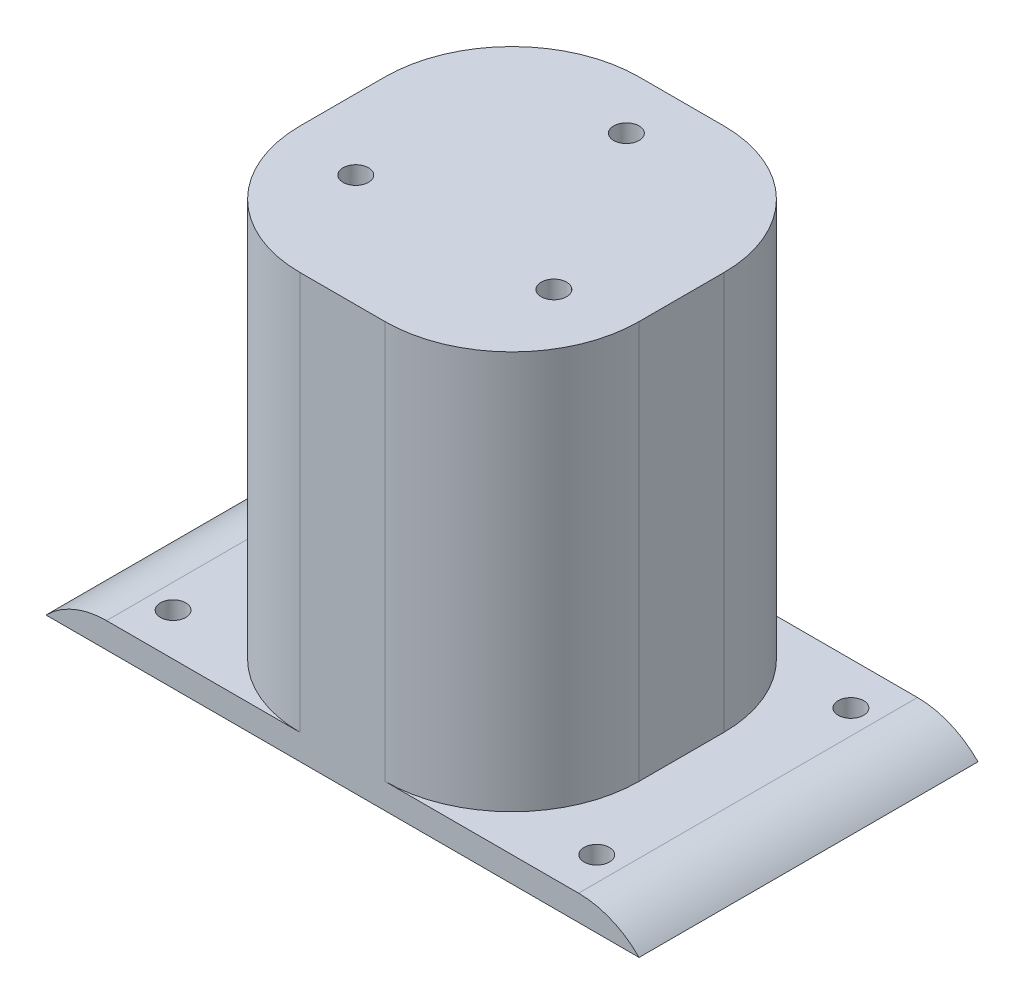
ISO-10303-21;
HEADER;
FILE_DESCRIPTION(('STEP AP214'),'2;1');
FILE_NAME('part.step','',(''),(''),'','','');
FILE_SCHEMA(('AUTOMOTIVE_DESIGN { 1 0 10303 214 1 1 1 1 }'));
ENDSEC;
DATA;
#1=APPLICATION_CONTEXT('core data for automotive mechanical design processes');
#2=APPLICATION_PROTOCOL_DEFINITION('international standard','automotive_design',2000,#1);
#3=PRODUCT_CONTEXT('',#1,'mechanical');
#4=PRODUCT('Part','Part','',(#3));
#5=PRODUCT_RELATED_PRODUCT_CATEGORY('part','',(#4));
#6=PRODUCT_DEFINITION_FORMATION('','',#4);
#7=PRODUCT_DEFINITION_CONTEXT('part definition',#1,'design');
#8=PRODUCT_DEFINITION('design','',#6,#7);
#9=PRODUCT_DEFINITION_SHAPE('','',#8);
#10=(LENGTH_UNIT() NAMED_UNIT(*) SI_UNIT(.MILLI.,.METRE.));
#11=(NAMED_UNIT(*) PLANE_ANGLE_UNIT() SI_UNIT($,.RADIAN.));
#12=(NAMED_UNIT(*) SI_UNIT($,.STERADIAN.) SOLID_ANGLE_UNIT());
#13=UNCERTAINTY_MEASURE_WITH_UNIT(LENGTH_MEASURE(1.E-05),#10,'distance_accuracy_value','');
#14=(GEOMETRIC_REPRESENTATION_CONTEXT(3) GLOBAL_UNCERTAINTY_ASSIGNED_CONTEXT((#13)) GLOBAL_UNIT_ASSIGNED_CONTEXT((#10,
#11,#12)) REPRESENTATION_CONTEXT('',''));
#15=CARTESIAN_POINT('',(0.,0.,0.));
#16=DIRECTION('',(0.,0.,1.));
#17=DIRECTION('',(1.,0.,0.));
#18=AXIS2_PLACEMENT_3D('',#15,#16,#17);
#19=CARTESIAN_POINT('',(-20.,50.,0.));
#20=DIRECTION('',(-1.,0.,0.));
#21=DIRECTION('',(0.,0.,1.));
#22=AXIS2_PLACEMENT_3D('',#19,#20,#21);
#23=PLANE('',#22);
#24=DIRECTION('',(0.,0.,-1.));
#25=VECTOR('',#24,1.);
#26=CARTESIAN_POINT('',(-20.,3.,0.));
#27=LINE('',#26,#25);
#28=CARTESIAN_POINT('',(-20.,3.,4.99999999999999));
#29=VERTEX_POINT('',#28);
#30=CARTESIAN_POINT('',(-20.,3.,-5.));
#31=VERTEX_POINT('',#30);
#32=EDGE_CURVE('E263',#29,#31,#27,.T.);
#33=ORIENTED_EDGE('',*,*,#32,.F.);
#34=DIRECTION('',(0.,-1.,0.));
#35=VECTOR('',#34,1.);
#36=CARTESIAN_POINT('',(-20.,50.,4.99999999999999));
#37=LINE('',#36,#35);
#38=CARTESIAN_POINT('',(-20.,50.,4.99999999999999));
#39=VERTEX_POINT('',#38);
#40=EDGE_CURVE('E233',#29,#39,#37,.F.);
#41=ORIENTED_EDGE('',*,*,#40,.T.);
#42=DIRECTION('',(0.,0.,-1.));
#43=VECTOR('',#42,1.);
#44=CARTESIAN_POINT('',(-20.,50.,0.));
#45=LINE('',#44,#43);
#46=CARTESIAN_POINT('',(-20.,50.,-5.));
#47=VERTEX_POINT('',#46);
#48=EDGE_CURVE('E195',#39,#47,#45,.T.);
#49=ORIENTED_EDGE('',*,*,#48,.T.);
#50=DIRECTION('',(0.,-1.,0.));
#51=VECTOR('',#50,1.);
#52=CARTESIAN_POINT('',(-20.,3.,-5.));
#53=LINE('',#52,#51);
#54=EDGE_CURVE('E230',#47,#31,#53,.T.);
#55=ORIENTED_EDGE('',*,*,#54,.T.);
#56=EDGE_LOOP('',(#33,#41,#49,#55));
#57=FACE_BOUND('',#56,.T.);
#58=ADVANCED_FACE('F41',(#57),#23,.T.);
#59=CARTESIAN_POINT('',(0.,50.,20.));
#60=DIRECTION('',(0.,0.,1.));
#61=DIRECTION('',(1.,0.,0.));
#62=AXIS2_PLACEMENT_3D('',#59,#60,#61);
#63=PLANE('',#62);
#64=DIRECTION('',(-1.,0.,0.));
#65=VECTOR('',#64,1.);
#66=CARTESIAN_POINT('',(0.,50.,20.));
#67=LINE('',#66,#65);
#68=CARTESIAN_POINT('',(5.,50.,20.));
#69=VERTEX_POINT('',#68);
#70=CARTESIAN_POINT('',(-5.,50.,20.));
#71=VERTEX_POINT('',#70);
#72=EDGE_CURVE('E198',#69,#71,#67,.T.);
#73=ORIENTED_EDGE('',*,*,#72,.T.);
#74=DIRECTION('',(0.,-1.,0.));
#75=VECTOR('',#74,1.);
#76=CARTESIAN_POINT('',(-5.,50.,20.));
#77=LINE('',#76,#75);
#78=CARTESIAN_POINT('',(-5.,3.,20.));
#79=VERTEX_POINT('',#78);
#80=EDGE_CURVE('E227',#71,#79,#77,.T.);
#81=ORIENTED_EDGE('',*,*,#80,.T.);
#82=DIRECTION('',(-1.,0.,0.));
#83=VECTOR('',#82,1.);
#84=CARTESIAN_POINT('',(0.,3.,20.));
#85=LINE('',#84,#83);
#86=CARTESIAN_POINT('',(-27.8585715714571,3.,20.));
#87=VERTEX_POINT('',#86);
#88=EDGE_CURVE('E170',#79,#87,#85,.T.);
#89=ORIENTED_EDGE('',*,*,#88,.T.);
#90=CARTESIAN_POINT('',(-27.8585715714571,-7.,20.));
#91=DIRECTION('',(0.,0.,1.));
#92=DIRECTION('',(1.,0.,0.));
#93=AXIS2_PLACEMENT_3D('',#90,#91,#92);
#94=CIRCLE('',#93,10.);
#95=CARTESIAN_POINT('',(-35.,0.,20.));
#96=VERTEX_POINT('',#95);
#97=EDGE_CURVE('E220',#87,#96,#94,.T.);
#98=ORIENTED_EDGE('',*,*,#97,.T.);
#99=DIRECTION('',(-1.,0.,0.));
#100=VECTOR('',#99,1.);
#101=CARTESIAN_POINT('',(0.,0.,20.));
#102=LINE('',#101,#100);
#103=CARTESIAN_POINT('',(35.,0.,20.));
#104=VERTEX_POINT('',#103);
#105=EDGE_CURVE('E150',#104,#96,#102,.T.);
#106=ORIENTED_EDGE('',*,*,#105,.F.);
#107=CARTESIAN_POINT('',(27.8585715714572,-7.,20.));
#108=DIRECTION('',(0.,0.,1.));
#109=DIRECTION('',(1.,0.,0.));
#110=AXIS2_PLACEMENT_3D('',#107,#108,#109);
#111=CIRCLE('',#110,10.);
#112=CARTESIAN_POINT('',(27.8585715714572,3.,20.));
#113=VERTEX_POINT('',#112);
#114=EDGE_CURVE('E222',#104,#113,#111,.T.);
#115=ORIENTED_EDGE('',*,*,#114,.T.);
#116=DIRECTION('',(-1.,0.,0.));
#117=VECTOR('',#116,1.);
#118=CARTESIAN_POINT('',(0.,3.,20.));
#119=LINE('',#118,#117);
#120=CARTESIAN_POINT('',(5.,3.,20.));
#121=VERTEX_POINT('',#120);
#122=EDGE_CURVE('E173',#113,#121,#119,.T.);
#123=ORIENTED_EDGE('',*,*,#122,.T.);
#124=DIRECTION('',(0.,-1.,0.));
#125=VECTOR('',#124,1.);
#126=CARTESIAN_POINT('',(5.,50.,20.));
#127=LINE('',#126,#125);
#128=EDGE_CURVE('E225',#121,#69,#127,.F.);
#129=ORIENTED_EDGE('',*,*,#128,.T.);
#130=EDGE_LOOP('',(#73,#81,#89,#98,#106,#115,#123,#129));
#131=FACE_BOUND('',#130,.T.);
#132=ADVANCED_FACE('F286',(#131),#63,.T.);
#133=CARTESIAN_POINT('',(20.,50.,0.));
#134=DIRECTION('',(-1.,0.,0.));
#135=DIRECTION('',(0.,0.,1.));
#136=AXIS2_PLACEMENT_3D('',#133,#134,#135);
#137=PLANE('',#136);
#138=DIRECTION('',(0.,0.,-1.));
#139=VECTOR('',#138,1.);
#140=CARTESIAN_POINT('',(20.,3.,0.));
#141=LINE('',#140,#139);
#142=CARTESIAN_POINT('',(20.,3.,4.99999999999999));
#143=VERTEX_POINT('',#142);
#144=CARTESIAN_POINT('',(20.,3.,-5.));
#145=VERTEX_POINT('',#144);
#146=EDGE_CURVE('E171',#143,#145,#141,.T.);
#147=ORIENTED_EDGE('',*,*,#146,.T.);
#148=DIRECTION('',(0.,-1.,0.));
#149=VECTOR('',#148,1.);
#150=CARTESIAN_POINT('',(20.,50.,-5.));
#151=LINE('',#150,#149);
#152=CARTESIAN_POINT('',(20.,50.,-5.));
#153=VERTEX_POINT('',#152);
#154=EDGE_CURVE('E250',#145,#153,#151,.F.);
#155=ORIENTED_EDGE('',*,*,#154,.T.);
#156=DIRECTION('',(0.,0.,-1.));
#157=VECTOR('',#156,1.);
#158=CARTESIAN_POINT('',(20.,50.,0.));
#159=LINE('',#158,#157);
#160=CARTESIAN_POINT('',(20.,50.,4.99999999999999));
#161=VERTEX_POINT('',#160);
#162=EDGE_CURVE('E201',#161,#153,#159,.T.);
#163=ORIENTED_EDGE('',*,*,#162,.F.);
#164=DIRECTION('',(0.,-1.,0.));
#165=VECTOR('',#164,1.);
#166=CARTESIAN_POINT('',(20.,3.,4.99999999999999));
#167=LINE('',#166,#165);
#168=EDGE_CURVE('E248',#161,#143,#167,.T.);
#169=ORIENTED_EDGE('',*,*,#168,.T.);
#170=EDGE_LOOP('',(#147,#155,#163,#169));
#171=FACE_BOUND('',#170,.T.);
#172=ADVANCED_FACE('F331',(#171),#137,.F.);
#173=CARTESIAN_POINT('',(0.,50.,-13.5));
#174=DIRECTION('',(0.,-1.,0.));
#175=DIRECTION('',(0.,0.,-1.));
#176=AXIS2_PLACEMENT_3D('',#173,#174,#175);
#177=CYLINDRICAL_SURFACE('',#176,1.5);
#178=CARTESIAN_POINT('',(0.,50.,-13.5));
#179=DIRECTION('',(0.,1.,0.));
#180=DIRECTION('',(0.,0.,1.));
#181=AXIS2_PLACEMENT_3D('',#178,#179,#180);
#182=CIRCLE('',#181,1.5);
#183=CARTESIAN_POINT('',(0.,50.,-12.));
#184=VERTEX_POINT('',#183);
#185=EDGE_CURVE('E192',#184,#184,#182,.T.);
#186=ORIENTED_EDGE('',*,*,#185,.T.);
#187=EDGE_LOOP('',(#186));
#188=FACE_BOUND('',#187,.T.);
#189=CARTESIAN_POINT('',(0.,0.,-13.5));
#190=DIRECTION('',(0.,1.,0.));
#191=DIRECTION('',(0.,0.,1.));
#192=AXIS2_PLACEMENT_3D('',#189,#190,#191);
#193=CIRCLE('',#192,1.5);
#194=CARTESIAN_POINT('',(0.,0.,-12.));
#195=VERTEX_POINT('',#194);
#196=EDGE_CURVE('E213',#195,#195,#193,.T.);
#197=ORIENTED_EDGE('',*,*,#196,.F.);
#198=EDGE_LOOP('',(#197));
#199=FACE_BOUND('',#198,.T.);
#200=ADVANCED_FACE('F335',(#188,#199),#177,.F.);
#201=CARTESIAN_POINT('',(11.6913429510899,50.,6.75000000000007));
#202=DIRECTION('',(0.,-1.,0.));
#203=DIRECTION('',(0.,0.,-1.));
#204=AXIS2_PLACEMENT_3D('',#201,#202,#203);
#205=CYLINDRICAL_SURFACE('',#204,1.5);
#206=CARTESIAN_POINT('',(11.6913429510899,50.,6.75000000000007));
#207=DIRECTION('',(0.,1.,0.));
#208=DIRECTION('',(0.,0.,1.));
#209=AXIS2_PLACEMENT_3D('',#206,#207,#208);
#210=CIRCLE('',#209,1.5);
#211=CARTESIAN_POINT('',(11.6913429510899,50.,8.25000000000007));
#212=VERTEX_POINT('',#211);
#213=EDGE_CURVE('E189',#212,#212,#210,.T.);
#214=ORIENTED_EDGE('',*,*,#213,.T.);
#215=EDGE_LOOP('',(#214));
#216=FACE_BOUND('',#215,.T.);
#217=CARTESIAN_POINT('',(11.6913429510899,0.,6.75000000000007));
#218=DIRECTION('',(0.,1.,0.));
#219=DIRECTION('',(0.,0.,1.));
#220=AXIS2_PLACEMENT_3D('',#217,#218,#219);
#221=CIRCLE('',#220,1.5);
#222=CARTESIAN_POINT('',(11.6913429510899,0.,8.25000000000007));
#223=VERTEX_POINT('',#222);
#224=EDGE_CURVE('E210',#223,#223,#221,.T.);
#225=ORIENTED_EDGE('',*,*,#224,.F.);
#226=EDGE_LOOP('',(#225));
#227=FACE_BOUND('',#226,.T.);
#228=ADVANCED_FACE('F338',(#216,#227),#205,.F.);
#229=CARTESIAN_POINT('',(-11.69134295109,50.,6.74999999999989));
#230=DIRECTION('',(0.,-1.,0.));
#231=DIRECTION('',(0.,0.,-1.));
#232=AXIS2_PLACEMENT_3D('',#229,#230,#231);
#233=CYLINDRICAL_SURFACE('',#232,1.5);
#234=CARTESIAN_POINT('',(-11.69134295109,50.,6.74999999999989));
#235=DIRECTION('',(0.,1.,0.));
#236=DIRECTION('',(0.,0.,1.));
#237=AXIS2_PLACEMENT_3D('',#234,#235,#236);
#238=CIRCLE('',#237,1.5);
#239=CARTESIAN_POINT('',(-11.69134295109,50.,8.24999999999989));
#240=VERTEX_POINT('',#239);
#241=EDGE_CURVE('E149',#240,#240,#238,.T.);
#242=ORIENTED_EDGE('',*,*,#241,.T.);
#243=EDGE_LOOP('',(#242));
#244=FACE_BOUND('',#243,.T.);
#245=CARTESIAN_POINT('',(-11.69134295109,0.,6.74999999999989));
#246=DIRECTION('',(0.,1.,0.));
#247=DIRECTION('',(0.,0.,1.));
#248=AXIS2_PLACEMENT_3D('',#245,#246,#247);
#249=CIRCLE('',#248,1.5);
#250=CARTESIAN_POINT('',(-11.69134295109,0.,8.24999999999989));
#251=VERTEX_POINT('',#250);
#252=EDGE_CURVE('E207',#251,#251,#249,.T.);
#253=ORIENTED_EDGE('',*,*,#252,.F.);
#254=EDGE_LOOP('',(#253));
#255=FACE_BOUND('',#254,.T.);
#256=ADVANCED_FACE('F342',(#244,#255),#233,.F.);
#257=CARTESIAN_POINT('',(0.,50.,-20.));
#258=DIRECTION('',(0.,0.,1.));
#259=DIRECTION('',(1.,0.,0.));
#260=AXIS2_PLACEMENT_3D('',#257,#258,#259);
#261=PLANE('',#260);
#262=DIRECTION('',(-1.,0.,0.));
#263=VECTOR('',#262,1.);
#264=CARTESIAN_POINT('',(0.,3.,-20.));
#265=LINE('',#264,#263);
#266=CARTESIAN_POINT('',(-5.,3.,-20.));
#267=VERTEX_POINT('',#266);
#268=CARTESIAN_POINT('',(-27.8585715714571,3.,-20.));
#269=VERTEX_POINT('',#268);
#270=EDGE_CURVE('E261',#267,#269,#265,.T.);
#271=ORIENTED_EDGE('',*,*,#270,.F.);
#272=DIRECTION('',(0.,-1.,0.));
#273=VECTOR('',#272,1.);
#274=CARTESIAN_POINT('',(-5.,50.,-20.));
#275=LINE('',#274,#273);
#276=CARTESIAN_POINT('',(-5.,50.,-20.));
#277=VERTEX_POINT('',#276);
#278=EDGE_CURVE('E246',#267,#277,#275,.F.);
#279=ORIENTED_EDGE('',*,*,#278,.T.);
#280=DIRECTION('',(-1.,0.,0.));
#281=VECTOR('',#280,1.);
#282=CARTESIAN_POINT('',(0.,50.,-20.));
#283=LINE('',#282,#281);
#284=CARTESIAN_POINT('',(5.,50.,-20.));
#285=VERTEX_POINT('',#284);
#286=EDGE_CURVE('E204',#285,#277,#283,.T.);
#287=ORIENTED_EDGE('',*,*,#286,.F.);
#288=DIRECTION('',(0.,-1.,0.));
#289=VECTOR('',#288,1.);
#290=CARTESIAN_POINT('',(5.,50.,-20.));
#291=LINE('',#290,#289);
#292=CARTESIAN_POINT('',(5.,3.,-20.));
#293=VERTEX_POINT('',#292);
#294=EDGE_CURVE('E243',#285,#293,#291,.T.);
#295=ORIENTED_EDGE('',*,*,#294,.T.);
#296=DIRECTION('',(-1.,0.,0.));
#297=VECTOR('',#296,1.);
#298=CARTESIAN_POINT('',(0.,3.,-20.));
#299=LINE('',#298,#297);
#300=CARTESIAN_POINT('',(27.8585715714572,3.,-20.));
#301=VERTEX_POINT('',#300);
#302=EDGE_CURVE('E176',#301,#293,#299,.T.);
#303=ORIENTED_EDGE('',*,*,#302,.F.);
#304=CARTESIAN_POINT('',(27.8585715714572,-7.,-20.));
#305=DIRECTION('',(0.,0.,1.));
#306=DIRECTION('',(1.,0.,0.));
#307=AXIS2_PLACEMENT_3D('',#304,#305,#306);
#308=CIRCLE('',#307,10.);
#309=CARTESIAN_POINT('',(35.,0.,-20.));
#310=VERTEX_POINT('',#309);
#311=EDGE_CURVE('E139',#301,#310,#308,.F.);
#312=ORIENTED_EDGE('',*,*,#311,.T.);
#313=DIRECTION('',(-1.,0.,0.));
#314=VECTOR('',#313,1.);
#315=CARTESIAN_POINT('',(0.,0.,-20.));
#316=LINE('',#315,#314);
#317=CARTESIAN_POINT('',(-35.,0.,-20.));
#318=VERTEX_POINT('',#317);
#319=EDGE_CURVE('E143',#310,#318,#316,.T.);
#320=ORIENTED_EDGE('',*,*,#319,.T.);
#321=CARTESIAN_POINT('',(-27.8585715714571,-7.,-20.));
#322=DIRECTION('',(0.,0.,1.));
#323=DIRECTION('',(1.,0.,0.));
#324=AXIS2_PLACEMENT_3D('',#321,#322,#323);
#325=CIRCLE('',#324,10.);
#326=EDGE_CURVE('E130',#318,#269,#325,.F.);
#327=ORIENTED_EDGE('',*,*,#326,.T.);
#328=EDGE_LOOP('',(#271,#279,#287,#295,#303,#312,#320,#327));
#329=FACE_BOUND('',#328,.T.);
#330=ADVANCED_FACE('F144',(#329),#261,.F.);
#331=CARTESIAN_POINT('',(0.,50.,0.));
#332=DIRECTION('',(0.,1.,0.));
#333=DIRECTION('',(0.,0.,1.));
#334=AXIS2_PLACEMENT_3D('',#331,#332,#333);
#335=PLANE('',#334);
#336=ORIENTED_EDGE('',*,*,#241,.F.);
#337=EDGE_LOOP('',(#336));
#338=FACE_BOUND('',#337,.T.);
#339=ORIENTED_EDGE('',*,*,#213,.F.);
#340=EDGE_LOOP('',(#339));
#341=FACE_BOUND('',#340,.T.);
#342=ORIENTED_EDGE('',*,*,#185,.F.);
#343=EDGE_LOOP('',(#342));
#344=FACE_BOUND('',#343,.T.);
#345=ORIENTED_EDGE('',*,*,#48,.F.);
#346=CARTESIAN_POINT('',(-5.,50.,4.99999999999999));
#347=DIRECTION('',(0.,1.,0.));
#348=DIRECTION('',(0.,0.,1.));
#349=AXIS2_PLACEMENT_3D('',#346,#347,#348);
#350=CIRCLE('',#349,15.);
#351=EDGE_CURVE('E241',#39,#71,#350,.T.);
#352=ORIENTED_EDGE('',*,*,#351,.T.);
#353=ORIENTED_EDGE('',*,*,#72,.F.);
#354=CARTESIAN_POINT('',(5.,50.,4.99999999999999));
#355=DIRECTION('',(0.,1.,0.));
#356=DIRECTION('',(0.,0.,1.));
#357=AXIS2_PLACEMENT_3D('',#354,#355,#356);
#358=CIRCLE('',#357,15.);
#359=EDGE_CURVE('E235',#69,#161,#358,.T.);
#360=ORIENTED_EDGE('',*,*,#359,.T.);
#361=ORIENTED_EDGE('',*,*,#162,.T.);
#362=CARTESIAN_POINT('',(5.,50.,-5.));
#363=DIRECTION('',(0.,1.,0.));
#364=DIRECTION('',(0.,0.,1.));
#365=AXIS2_PLACEMENT_3D('',#362,#363,#364);
#366=CIRCLE('',#365,15.);
#367=EDGE_CURVE('E237',#153,#285,#366,.T.);
#368=ORIENTED_EDGE('',*,*,#367,.T.);
#369=ORIENTED_EDGE('',*,*,#286,.T.);
#370=CARTESIAN_POINT('',(-5.,50.,-5.));
#371=DIRECTION('',(0.,1.,0.));
#372=DIRECTION('',(0.,0.,1.));
#373=AXIS2_PLACEMENT_3D('',#370,#371,#372);
#374=CIRCLE('',#373,15.);
#375=EDGE_CURVE('E239',#277,#47,#374,.T.);
#376=ORIENTED_EDGE('',*,*,#375,.T.);
#377=EDGE_LOOP('',(#345,#352,#353,#360,#361,#368,#369,#376));
#378=FACE_BOUND('',#377,.T.);
#379=ADVANCED_FACE('F272',(#338,#341,#344,#378),#335,.T.);
#380=CARTESIAN_POINT('',(0.,0.,0.));
#381=DIRECTION('',(0.,1.,0.));
#382=DIRECTION('',(0.,0.,1.));
#383=AXIS2_PLACEMENT_3D('',#380,#381,#382);
#384=PLANE('',#383);
#385=ORIENTED_EDGE('',*,*,#252,.T.);
#386=EDGE_LOOP('',(#385));
#387=FACE_BOUND('',#386,.T.);
#388=ORIENTED_EDGE('',*,*,#224,.T.);
#389=EDGE_LOOP('',(#388));
#390=FACE_BOUND('',#389,.T.);
#391=ORIENTED_EDGE('',*,*,#196,.T.);
#392=EDGE_LOOP('',(#391));
#393=FACE_BOUND('',#392,.T.);
#394=ORIENTED_EDGE('',*,*,#105,.T.);
#395=DIRECTION('',(0.,0.,-1.));
#396=VECTOR('',#395,1.);
#397=CARTESIAN_POINT('',(-35.,0.,0.));
#398=LINE('',#397,#396);
#399=EDGE_CURVE('E135',#96,#318,#398,.T.);
#400=ORIENTED_EDGE('',*,*,#399,.T.);
#401=ORIENTED_EDGE('',*,*,#319,.F.);
#402=DIRECTION('',(0.,0.,-1.));
#403=VECTOR('',#402,1.);
#404=CARTESIAN_POINT('',(35.,0.,0.));
#405=LINE('',#404,#403);
#406=EDGE_CURVE('E180',#104,#310,#405,.T.);
#407=ORIENTED_EDGE('',*,*,#406,.F.);
#408=EDGE_LOOP('',(#394,#400,#401,#407));
#409=FACE_BOUND('',#408,.T.);
#410=CARTESIAN_POINT('',(25.,0.,15.));
#411=DIRECTION('',(0.,1.,0.));
#412=DIRECTION('',(0.,0.,1.));
#413=AXIS2_PLACEMENT_3D('',#410,#411,#412);
#414=CIRCLE('',#413,1.5);
#415=CARTESIAN_POINT('',(25.,0.,16.5));
#416=VERTEX_POINT('',#415);
#417=EDGE_CURVE('E182',#416,#416,#414,.T.);
#418=ORIENTED_EDGE('',*,*,#417,.T.);
#419=EDGE_LOOP('',(#418));
#420=FACE_BOUND('',#419,.T.);
#421=CARTESIAN_POINT('',(25.,0.,-15.));
#422=DIRECTION('',(0.,1.,0.));
#423=DIRECTION('',(0.,0.,1.));
#424=AXIS2_PLACEMENT_3D('',#421,#422,#423);
#425=CIRCLE('',#424,1.5);
#426=CARTESIAN_POINT('',(25.,0.,-13.5));
#427=VERTEX_POINT('',#426);
#428=EDGE_CURVE('E174',#427,#427,#425,.F.);
#429=ORIENTED_EDGE('',*,*,#428,.F.);
#430=EDGE_LOOP('',(#429));
#431=FACE_BOUND('',#430,.T.);
#432=CARTESIAN_POINT('',(-25.,0.,-15.));
#433=DIRECTION('',(0.,1.,0.));
#434=DIRECTION('',(0.,0.,1.));
#435=AXIS2_PLACEMENT_3D('',#432,#433,#434);
#436=CIRCLE('',#435,1.5);
#437=CARTESIAN_POINT('',(-25.,0.,-13.5));
#438=VERTEX_POINT('',#437);
#439=EDGE_CURVE('E155',#438,#438,#436,.T.);
#440=ORIENTED_EDGE('',*,*,#439,.T.);
#441=EDGE_LOOP('',(#440));
#442=FACE_BOUND('',#441,.T.);
#443=CARTESIAN_POINT('',(-25.,0.,15.));
#444=DIRECTION('',(0.,1.,0.));
#445=DIRECTION('',(0.,0.,1.));
#446=AXIS2_PLACEMENT_3D('',#443,#444,#445);
#447=CIRCLE('',#446,1.5);
#448=CARTESIAN_POINT('',(-25.,0.,16.5));
#449=VERTEX_POINT('',#448);
#450=EDGE_CURVE('E159',#449,#449,#447,.F.);
#451=ORIENTED_EDGE('',*,*,#450,.F.);
#452=EDGE_LOOP('',(#451));
#453=FACE_BOUND('',#452,.T.);
#454=ADVANCED_FACE('F153',(#387,#390,#393,#409,#420,#431,#442,#453),#384,.F.);
#455=CARTESIAN_POINT('',(25.,3.,15.));
#456=DIRECTION('',(0.,-1.,0.));
#457=DIRECTION('',(0.,0.,-1.));
#458=AXIS2_PLACEMENT_3D('',#455,#456,#457);
#459=CYLINDRICAL_SURFACE('',#458,1.5);
#460=CARTESIAN_POINT('',(25.,3.,15.));
#461=DIRECTION('',(0.,1.,0.));
#462=DIRECTION('',(0.,0.,1.));
#463=AXIS2_PLACEMENT_3D('',#460,#461,#462);
#464=CIRCLE('',#463,1.5);
#465=CARTESIAN_POINT('',(25.,3.,16.5));
#466=VERTEX_POINT('',#465);
#467=EDGE_CURVE('E162',#466,#466,#464,.T.);
#468=ORIENTED_EDGE('',*,*,#467,.T.);
#469=EDGE_LOOP('',(#468));
#470=FACE_BOUND('',#469,.T.);
#471=ORIENTED_EDGE('',*,*,#417,.F.);
#472=EDGE_LOOP('',(#471));
#473=FACE_BOUND('',#472,.T.);
#474=ADVANCED_FACE('F309',(#470,#473),#459,.F.);
#475=CARTESIAN_POINT('',(25.,3.,-15.));
#476=DIRECTION('',(0.,-1.,0.));
#477=DIRECTION('',(0.,0.,-1.));
#478=AXIS2_PLACEMENT_3D('',#475,#476,#477);
#479=CYLINDRICAL_SURFACE('',#478,1.5);
#480=CARTESIAN_POINT('',(25.,3.,-15.));
#481=DIRECTION('',(0.,1.,0.));
#482=DIRECTION('',(0.,0.,1.));
#483=AXIS2_PLACEMENT_3D('',#480,#481,#482);
#484=CIRCLE('',#483,1.5);
#485=CARTESIAN_POINT('',(25.,3.,-13.5));
#486=VERTEX_POINT('',#485);
#487=EDGE_CURVE('E156',#486,#486,#484,.F.);
#488=ORIENTED_EDGE('',*,*,#487,.F.);
#489=EDGE_LOOP('',(#488));
#490=FACE_BOUND('',#489,.T.);
#491=ORIENTED_EDGE('',*,*,#428,.T.);
#492=EDGE_LOOP('',(#491));
#493=FACE_BOUND('',#492,.T.);
#494=ADVANCED_FACE('F316',(#490,#493),#479,.F.);
#495=CARTESIAN_POINT('',(0.,3.,0.));
#496=DIRECTION('',(0.,1.,0.));
#497=DIRECTION('',(0.,0.,1.));
#498=AXIS2_PLACEMENT_3D('',#495,#496,#497);
#499=PLANE('',#498);
#500=ORIENTED_EDGE('',*,*,#122,.F.);
#501=DIRECTION('',(0.,0.,1.));
#502=VECTOR('',#501,1.);
#503=CARTESIAN_POINT('',(27.8585715714572,3.,-20.));
#504=LINE('',#503,#502);
#505=EDGE_CURVE('E140',#113,#301,#504,.F.);
#506=ORIENTED_EDGE('',*,*,#505,.T.);
#507=ORIENTED_EDGE('',*,*,#302,.T.);
#508=CARTESIAN_POINT('',(5.,3.,-5.));
#509=DIRECTION('',(0.,1.,0.));
#510=DIRECTION('',(0.,0.,1.));
#511=AXIS2_PLACEMENT_3D('',#508,#509,#510);
#512=CIRCLE('',#511,15.);
#513=EDGE_CURVE('E49',#293,#145,#512,.F.);
#514=ORIENTED_EDGE('',*,*,#513,.T.);
#515=ORIENTED_EDGE('',*,*,#146,.F.);
#516=CARTESIAN_POINT('',(5.,3.,4.99999999999999));
#517=DIRECTION('',(0.,1.,0.));
#518=DIRECTION('',(0.,0.,1.));
#519=AXIS2_PLACEMENT_3D('',#516,#517,#518);
#520=CIRCLE('',#519,15.);
#521=EDGE_CURVE('E11',#143,#121,#520,.F.);
#522=ORIENTED_EDGE('',*,*,#521,.T.);
#523=EDGE_LOOP('',(#500,#506,#507,#514,#515,#522));
#524=FACE_BOUND('',#523,.T.);
#525=ORIENTED_EDGE('',*,*,#467,.F.);
#526=EDGE_LOOP('',(#525));
#527=FACE_BOUND('',#526,.T.);
#528=ORIENTED_EDGE('',*,*,#487,.T.);
#529=EDGE_LOOP('',(#528));
#530=FACE_BOUND('',#529,.T.);
#531=ADVANCED_FACE('F279',(#524,#527,#530),#499,.T.);
#532=CARTESIAN_POINT('',(-25.,3.,-15.));
#533=DIRECTION('',(0.,-1.,0.));
#534=DIRECTION('',(0.,0.,-1.));
#535=AXIS2_PLACEMENT_3D('',#532,#533,#534);
#536=CYLINDRICAL_SURFACE('',#535,1.5);
#537=CARTESIAN_POINT('',(-25.,3.,-15.));
#538=DIRECTION('',(0.,1.,0.));
#539=DIRECTION('',(0.,0.,1.));
#540=AXIS2_PLACEMENT_3D('',#537,#538,#539);
#541=CIRCLE('',#540,1.5);
#542=CARTESIAN_POINT('',(-25.,3.,-13.5));
#543=VERTEX_POINT('',#542);
#544=EDGE_CURVE('E293',#543,#543,#541,.T.);
#545=ORIENTED_EDGE('',*,*,#544,.T.);
#546=EDGE_LOOP('',(#545));
#547=FACE_BOUND('',#546,.T.);
#548=ORIENTED_EDGE('',*,*,#439,.F.);
#549=EDGE_LOOP('',(#548));
#550=FACE_BOUND('',#549,.T.);
#551=ADVANCED_FACE('F304',(#547,#550),#536,.F.);
#552=CARTESIAN_POINT('',(-25.,3.,15.));
#553=DIRECTION('',(0.,-1.,0.));
#554=DIRECTION('',(0.,0.,-1.));
#555=AXIS2_PLACEMENT_3D('',#552,#553,#554);
#556=CYLINDRICAL_SURFACE('',#555,1.5);
#557=CARTESIAN_POINT('',(-25.,3.,15.));
#558=DIRECTION('',(0.,1.,0.));
#559=DIRECTION('',(0.,0.,1.));
#560=AXIS2_PLACEMENT_3D('',#557,#558,#559);
#561=CIRCLE('',#560,1.5);
#562=CARTESIAN_POINT('',(-25.,3.,16.5));
#563=VERTEX_POINT('',#562);
#564=EDGE_CURVE('E165',#563,#563,#561,.F.);
#565=ORIENTED_EDGE('',*,*,#564,.F.);
#566=EDGE_LOOP('',(#565));
#567=FACE_BOUND('',#566,.T.);
#568=ORIENTED_EDGE('',*,*,#450,.T.);
#569=EDGE_LOOP('',(#568));
#570=FACE_BOUND('',#569,.T.);
#571=ADVANCED_FACE('F301',(#567,#570),#556,.F.);
#572=CARTESIAN_POINT('',(0.,3.,0.));
#573=DIRECTION('',(0.,1.,0.));
#574=DIRECTION('',(0.,0.,1.));
#575=AXIS2_PLACEMENT_3D('',#572,#573,#574);
#576=PLANE('',#575);
#577=ORIENTED_EDGE('',*,*,#270,.T.);
#578=DIRECTION('',(0.,0.,1.));
#579=VECTOR('',#578,1.);
#580=CARTESIAN_POINT('',(-27.8585715714571,3.,20.));
#581=LINE('',#580,#579);
#582=EDGE_CURVE('E136',#269,#87,#581,.T.);
#583=ORIENTED_EDGE('',*,*,#582,.T.);
#584=ORIENTED_EDGE('',*,*,#88,.F.);
#585=CARTESIAN_POINT('',(-5.,3.,4.99999999999999));
#586=DIRECTION('',(0.,1.,0.));
#587=DIRECTION('',(0.,0.,1.));
#588=AXIS2_PLACEMENT_3D('',#585,#586,#587);
#589=CIRCLE('',#588,15.);
#590=EDGE_CURVE('E252',#79,#29,#589,.F.);
#591=ORIENTED_EDGE('',*,*,#590,.T.);
#592=ORIENTED_EDGE('',*,*,#32,.T.);
#593=CARTESIAN_POINT('',(-5.,3.,-5.));
#594=DIRECTION('',(0.,1.,0.));
#595=DIRECTION('',(0.,0.,1.));
#596=AXIS2_PLACEMENT_3D('',#593,#594,#595);
#597=CIRCLE('',#596,15.);
#598=EDGE_CURVE('E254',#31,#267,#597,.F.);
#599=ORIENTED_EDGE('',*,*,#598,.T.);
#600=EDGE_LOOP('',(#577,#583,#584,#591,#592,#599));
#601=FACE_BOUND('',#600,.T.);
#602=ORIENTED_EDGE('',*,*,#544,.F.);
#603=EDGE_LOOP('',(#602));
#604=FACE_BOUND('',#603,.T.);
#605=ORIENTED_EDGE('',*,*,#564,.T.);
#606=EDGE_LOOP('',(#605));
#607=FACE_BOUND('',#606,.T.);
#608=ADVANCED_FACE('F259',(#601,#604,#607),#576,.T.);
#609=CARTESIAN_POINT('',(27.8585715714572,-7.,0.));
#610=DIRECTION('',(0.,0.,-1.));
#611=DIRECTION('',(-1.,0.,0.));
#612=AXIS2_PLACEMENT_3D('',#609,#610,#611);
#613=CYLINDRICAL_SURFACE('',#612,10.);
#614=ORIENTED_EDGE('',*,*,#114,.F.);
#615=ORIENTED_EDGE('',*,*,#406,.T.);
#616=ORIENTED_EDGE('',*,*,#311,.F.);
#617=ORIENTED_EDGE('',*,*,#505,.F.);
#618=EDGE_LOOP('',(#614,#615,#616,#617));
#619=FACE_BOUND('',#618,.T.);
#620=ADVANCED_FACE('F284',(#619),#613,.T.);
#621=CARTESIAN_POINT('',(-27.8585715714571,-7.,0.));
#622=DIRECTION('',(0.,0.,-1.));
#623=DIRECTION('',(-1.,0.,0.));
#624=AXIS2_PLACEMENT_3D('',#621,#622,#623);
#625=CYLINDRICAL_SURFACE('',#624,10.);
#626=ORIENTED_EDGE('',*,*,#97,.F.);
#627=ORIENTED_EDGE('',*,*,#582,.F.);
#628=ORIENTED_EDGE('',*,*,#326,.F.);
#629=ORIENTED_EDGE('',*,*,#399,.F.);
#630=EDGE_LOOP('',(#626,#627,#628,#629));
#631=FACE_BOUND('',#630,.T.);
#632=ADVANCED_FACE('F133',(#631),#625,.T.);
#633=CARTESIAN_POINT('',(-5.,50.,4.99999999999999));
#634=DIRECTION('',(0.,-1.,0.));
#635=DIRECTION('',(0.,0.,-1.));
#636=AXIS2_PLACEMENT_3D('',#633,#634,#635);
#637=CYLINDRICAL_SURFACE('',#636,15.);
#638=ORIENTED_EDGE('',*,*,#351,.F.);
#639=ORIENTED_EDGE('',*,*,#40,.F.);
#640=ORIENTED_EDGE('',*,*,#590,.F.);
#641=ORIENTED_EDGE('',*,*,#80,.F.);
#642=EDGE_LOOP('',(#638,#639,#640,#641));
#643=FACE_BOUND('',#642,.T.);
#644=ADVANCED_FACE('F349',(#643),#637,.T.);
#645=CARTESIAN_POINT('',(-5.,50.,-5.));
#646=DIRECTION('',(0.,1.,0.));
#647=DIRECTION('',(0.,0.,1.));
#648=AXIS2_PLACEMENT_3D('',#645,#646,#647);
#649=CYLINDRICAL_SURFACE('',#648,15.);
#650=ORIENTED_EDGE('',*,*,#375,.F.);
#651=ORIENTED_EDGE('',*,*,#278,.F.);
#652=ORIENTED_EDGE('',*,*,#598,.F.);
#653=ORIENTED_EDGE('',*,*,#54,.F.);
#654=EDGE_LOOP('',(#650,#651,#652,#653));
#655=FACE_BOUND('',#654,.T.);
#656=ADVANCED_FACE('F267',(#655),#649,.T.);
#657=CARTESIAN_POINT('',(5.,50.,-5.));
#658=DIRECTION('',(0.,-1.,0.));
#659=DIRECTION('',(0.,0.,-1.));
#660=AXIS2_PLACEMENT_3D('',#657,#658,#659);
#661=CYLINDRICAL_SURFACE('',#660,15.);
#662=ORIENTED_EDGE('',*,*,#367,.F.);
#663=ORIENTED_EDGE('',*,*,#154,.F.);
#664=ORIENTED_EDGE('',*,*,#513,.F.);
#665=ORIENTED_EDGE('',*,*,#294,.F.);
#666=EDGE_LOOP('',(#662,#663,#664,#665));
#667=FACE_BOUND('',#666,.T.);
#668=ADVANCED_FACE('F277',(#667),#661,.T.);
#669=CARTESIAN_POINT('',(5.,50.,4.99999999999999));
#670=DIRECTION('',(0.,1.,0.));
#671=DIRECTION('',(0.,0.,1.));
#672=AXIS2_PLACEMENT_3D('',#669,#670,#671);
#673=CYLINDRICAL_SURFACE('',#672,15.);
#674=ORIENTED_EDGE('',*,*,#359,.F.);
#675=ORIENTED_EDGE('',*,*,#128,.F.);
#676=ORIENTED_EDGE('',*,*,#521,.F.);
#677=ORIENTED_EDGE('',*,*,#168,.F.);
#678=EDGE_LOOP('',(#674,#675,#676,#677));
#679=FACE_BOUND('',#678,.T.);
#680=ADVANCED_FACE('F43',(#679),#673,.T.);
#681=CLOSED_SHELL('',(#58,#132,#172,#200,#228,#256,#330,#379,#454,#474,#494,#531,#551,#571,#608,
#620,#632,#644,#656,#668,#680));
#682=MANIFOLD_SOLID_BREP('B2',#681);
#683=ADVANCED_BREP_SHAPE_REPRESENTATION('',(#18,#682),#14);
#684=SHAPE_DEFINITION_REPRESENTATION(#9,#683);
ENDSEC;
END-ISO-10303-21;
